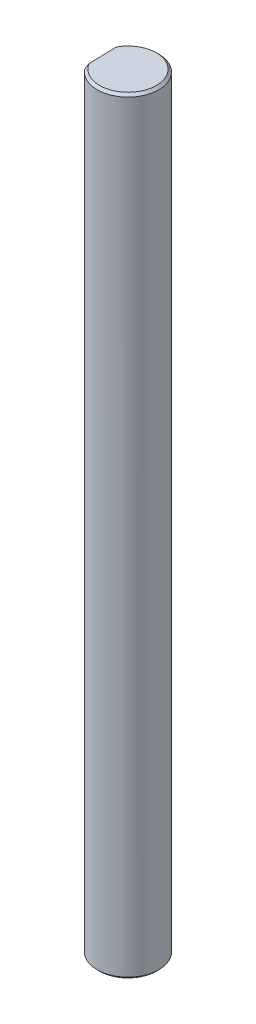
ISO-10303-21;
HEADER;
FILE_DESCRIPTION(('STEP AP214'),'2;1');
FILE_NAME('part.step','',(''),(''),'','','');
FILE_SCHEMA(('AUTOMOTIVE_DESIGN { 1 0 10303 214 1 1 1 1 }'));
ENDSEC;
DATA;
#1=APPLICATION_CONTEXT('core data for automotive mechanical design processes');
#2=APPLICATION_PROTOCOL_DEFINITION('international standard','automotive_design',2000,#1);
#3=PRODUCT_CONTEXT('',#1,'mechanical');
#4=PRODUCT('Part','Part','',(#3));
#5=PRODUCT_RELATED_PRODUCT_CATEGORY('part','',(#4));
#6=PRODUCT_DEFINITION_FORMATION('','',#4);
#7=PRODUCT_DEFINITION_CONTEXT('part definition',#1,'design');
#8=PRODUCT_DEFINITION('design','',#6,#7);
#9=PRODUCT_DEFINITION_SHAPE('','',#8);
#10=(LENGTH_UNIT() NAMED_UNIT(*) SI_UNIT(.MILLI.,.METRE.));
#11=(NAMED_UNIT(*) PLANE_ANGLE_UNIT() SI_UNIT($,.RADIAN.));
#12=(NAMED_UNIT(*) SI_UNIT($,.STERADIAN.) SOLID_ANGLE_UNIT());
#13=UNCERTAINTY_MEASURE_WITH_UNIT(LENGTH_MEASURE(1.E-05),#10,'distance_accuracy_value','');
#14=(GEOMETRIC_REPRESENTATION_CONTEXT(3) GLOBAL_UNCERTAINTY_ASSIGNED_CONTEXT((#13)) GLOBAL_UNIT_ASSIGNED_CONTEXT((#10,
#11,#12)) REPRESENTATION_CONTEXT('',''));
#15=CARTESIAN_POINT('',(0.,0.,0.));
#16=DIRECTION('',(0.,0.,1.));
#17=DIRECTION('',(1.,0.,0.));
#18=AXIS2_PLACEMENT_3D('',#15,#16,#17);
#19=CARTESIAN_POINT('',(0.,62.2,0.));
#20=DIRECTION('',(0.,-1.,0.));
#21=DIRECTION('',(0.,0.,-1.));
#22=AXIS2_PLACEMENT_3D('',#19,#20,#21);
#23=CYLINDRICAL_SURFACE('',#22,2.5);
#24=CARTESIAN_POINT('',(0.,0.200000000000027,0.));
#25=DIRECTION('',(0.,1.,0.));
#26=DIRECTION('',(0.,0.,1.));
#27=AXIS2_PLACEMENT_3D('',#24,#25,#26);
#28=CIRCLE('',#27,2.5);
#29=CARTESIAN_POINT('',(0.,0.200000000000027,2.5));
#30=VERTEX_POINT('',#29);
#31=EDGE_CURVE('E58',#30,#30,#28,.T.);
#32=ORIENTED_EDGE('',*,*,#31,.T.);
#33=EDGE_LOOP('',(#32));
#34=FACE_BOUND('',#33,.T.);
#35=DIRECTION('',(0.,1.,0.));
#36=VECTOR('',#35,1.);
#37=CARTESIAN_POINT('',(-2.03929167423056,42.2,-1.44612913234397));
#38=LINE('',#37,#36);
#39=CARTESIAN_POINT('',(-2.03929167423056,42.2,-1.44612913234397));
#40=VERTEX_POINT('',#39);
#41=CARTESIAN_POINT('',(-2.03929167423056,62.,-1.44612913234397));
#42=VERTEX_POINT('',#41);
#43=EDGE_CURVE('E95',#40,#42,#38,.T.);
#44=ORIENTED_EDGE('',*,*,#43,.T.);
#45=CARTESIAN_POINT('',(0.,62.,0.));
#46=DIRECTION('',(0.,1.,0.));
#47=DIRECTION('',(0.,0.,1.));
#48=AXIS2_PLACEMENT_3D('',#45,#46,#47);
#49=CIRCLE('',#48,2.5);
#50=CARTESIAN_POINT('',(-1.95928563583477,62.,1.55280385020502));
#51=VERTEX_POINT('',#50);
#52=EDGE_CURVE('E65',#42,#51,#49,.F.);
#53=ORIENTED_EDGE('',*,*,#52,.T.);
#54=DIRECTION('',(0.,1.,0.));
#55=VECTOR('',#54,1.);
#56=CARTESIAN_POINT('',(-1.95928563583477,42.2,1.55280385020502));
#57=LINE('',#56,#55);
#58=CARTESIAN_POINT('',(-1.95928563583477,42.2,1.55280385020502));
#59=VERTEX_POINT('',#58);
#60=EDGE_CURVE('E93',#59,#51,#57,.T.);
#61=ORIENTED_EDGE('',*,*,#60,.F.);
#62=CARTESIAN_POINT('',(0.,42.2,0.));
#63=DIRECTION('',(0.,1.,0.));
#64=DIRECTION('',(0.,0.,1.));
#65=AXIS2_PLACEMENT_3D('',#62,#63,#64);
#66=CIRCLE('',#65,2.5);
#67=EDGE_CURVE('E86',#40,#59,#66,.T.);
#68=ORIENTED_EDGE('',*,*,#67,.F.);
#69=EDGE_LOOP('',(#44,#53,#61,#68));
#70=FACE_BOUND('',#69,.T.);
#71=ADVANCED_FACE('F48',(#34,#70),#23,.T.);
#72=CARTESIAN_POINT('',(0.,62.2,0.));
#73=DIRECTION('',(0.,1.,0.));
#74=DIRECTION('',(0.,0.,1.));
#75=AXIS2_PLACEMENT_3D('',#72,#73,#74);
#76=PLANE('',#75);
#77=DIRECTION('',(-0.026668679465262,0.,-0.999644327516332));
#78=VECTOR('',#77,1.);
#79=CARTESIAN_POINT('',(-2.03929167423056,62.2,-1.44612913234397));
#80=LINE('',#79,#78);
#81=CARTESIAN_POINT('',(-1.96899885775531,62.2,1.18871506180346));
#82=VERTEX_POINT('',#81);
#83=CARTESIAN_POINT('',(-2.02957845231002,62.2,-1.08204034394241));
#84=VERTEX_POINT('',#83);
#85=EDGE_CURVE('E101',#82,#84,#80,.T.);
#86=ORIENTED_EDGE('',*,*,#85,.F.);
#87=CARTESIAN_POINT('',(0.,62.2,0.));
#88=DIRECTION('',(0.,1.,0.));
#89=DIRECTION('',(0.,0.,1.));
#90=AXIS2_PLACEMENT_3D('',#87,#88,#89);
#91=CIRCLE('',#90,2.30000000000003);
#92=EDGE_CURVE('E106',#82,#84,#91,.T.);
#93=ORIENTED_EDGE('',*,*,#92,.T.);
#94=EDGE_LOOP('',(#86,#93));
#95=FACE_BOUND('',#94,.T.);
#96=ADVANCED_FACE('F132',(#95),#76,.T.);
#97=CARTESIAN_POINT('',(0.,0.,0.));
#98=DIRECTION('',(0.,1.,0.));
#99=DIRECTION('',(0.,0.,1.));
#100=AXIS2_PLACEMENT_3D('',#97,#98,#99);
#101=PLANE('',#100);
#102=CARTESIAN_POINT('',(0.,0.,0.));
#103=DIRECTION('',(0.,1.,0.));
#104=DIRECTION('',(0.,0.,1.));
#105=AXIS2_PLACEMENT_3D('',#102,#103,#104);
#106=CIRCLE('',#105,2.29999999999998);
#107=CARTESIAN_POINT('',(0.,0.,2.29999999999998));
#108=VERTEX_POINT('',#107);
#109=EDGE_CURVE('E11',#108,#108,#106,.F.);
#110=ORIENTED_EDGE('',*,*,#109,.T.);
#111=EDGE_LOOP('',(#110));
#112=FACE_BOUND('',#111,.T.);
#113=ADVANCED_FACE('F131',(#112),#101,.F.);
#114=CARTESIAN_POINT('',(-2.03929167423056,42.2,-1.44612913234397));
#115=DIRECTION('',(0.999644327516332,0.,-0.026668679465262));
#116=DIRECTION('',(-0.026668679465262,0.,-0.999644327516332));
#117=AXIS2_PLACEMENT_3D('',#114,#115,#116);
#118=PLANE('',#117);
#119=ORIENTED_EDGE('',*,*,#85,.T.);
#120=CARTESIAN_POINT('',(-2.02957845231002,62.2,-1.08204034394241));
#121=CARTESIAN_POINT('',(-2.03040687863031,62.1846588897814,-1.11309293778839));
#122=CARTESIAN_POINT('',(-2.03123025191123,62.1689381376528,-1.14395612435072));
#123=CARTESIAN_POINT('',(-2.03286707796802,62.1368162971825,-1.20531063892007));
#124=CARTESIAN_POINT('',(-2.03368053472172,62.120415494086,-1.23580211603201));
#125=CARTESIAN_POINT('',(-2.03529835636134,62.0870005487157,-1.2964442722017));
#126=CARTESIAN_POINT('',(-2.03610272174081,62.0699864399503,-1.32659496976029));
#127=CARTESIAN_POINT('',(-2.03770328003974,62.0353973160197,-1.38659002975073));
#128=CARTESIAN_POINT('',(-2.03849946942627,62.0178220708339,-1.41643425975495));
#129=CARTESIAN_POINT('',(-2.03929167423056,62.,-1.44612913234397));
#130=B_SPLINE_CURVE_WITH_KNOTS('',3,(#120,#121,#122,#123,#124,#125,#126,#127,#128,#129),
.UNSPECIFIED.,.F.,.F.,(4,2,2,2,4),(0.,0.103930863284089,0.207818565532273,0.311700600383596,
0.415625779466335),.UNSPECIFIED.);
#131=EDGE_CURVE('E73',#84,#42,#130,.T.);
#132=ORIENTED_EDGE('',*,*,#131,.T.);
#133=ORIENTED_EDGE('',*,*,#43,.F.);
#134=DIRECTION('',(-0.026668679465262,0.,-0.999644327516332));
#135=VECTOR('',#134,1.);
#136=CARTESIAN_POINT('',(-2.03929167423056,42.2,-1.44612913234397));
#137=LINE('',#136,#135);
#138=EDGE_CURVE('E89',#59,#40,#137,.T.);
#139=ORIENTED_EDGE('',*,*,#138,.F.);
#140=ORIENTED_EDGE('',*,*,#60,.T.);
#141=CARTESIAN_POINT('',(-1.95928563583477,62.,1.55280385020502));
#142=CARTESIAN_POINT('',(-1.96007784063906,62.0178220708339,1.523108977616));
#143=CARTESIAN_POINT('',(-1.96087403002559,62.0353973160197,1.49326474761178));
#144=CARTESIAN_POINT('',(-1.96247458832452,62.0699864399503,1.43326968762133));
#145=CARTESIAN_POINT('',(-1.96327895370399,62.0870005487157,1.40311899006274));
#146=CARTESIAN_POINT('',(-1.96489677534361,62.120415494086,1.34247683389306));
#147=CARTESIAN_POINT('',(-1.96571023209731,62.1368162971825,1.31198535678112));
#148=CARTESIAN_POINT('',(-1.9673470581541,62.1689381376528,1.25063084221177));
#149=CARTESIAN_POINT('',(-1.96817043143502,62.1846588897814,1.21976765564944));
#150=CARTESIAN_POINT('',(-1.96899885775531,62.2,1.18871506180346));
#151=B_SPLINE_CURVE_WITH_KNOTS('',3,(#141,#142,#143,#144,#145,#146,#147,#148,#149,#150),
.UNSPECIFIED.,.F.,.F.,(4,2,2,2,4),(0.,0.103925179082747,0.207807213934062,0.311694916182246,
0.415625779466336),.UNSPECIFIED.);
#152=EDGE_CURVE('E110',#51,#82,#151,.T.);
#153=ORIENTED_EDGE('',*,*,#152,.T.);
#154=EDGE_LOOP('',(#119,#132,#133,#139,#140,#153));
#155=FACE_BOUND('',#154,.T.);
#156=ADVANCED_FACE('F92',(#155),#118,.F.);
#157=CARTESIAN_POINT('',(0.,42.2,0.));
#158=DIRECTION('',(0.,1.,0.));
#159=DIRECTION('',(0.,0.,1.));
#160=AXIS2_PLACEMENT_3D('',#157,#158,#159);
#161=PLANE('',#160);
#162=ORIENTED_EDGE('',*,*,#67,.T.);
#163=ORIENTED_EDGE('',*,*,#138,.T.);
#164=EDGE_LOOP('',(#162,#163));
#165=FACE_BOUND('',#164,.T.);
#166=ADVANCED_FACE('F88',(#165),#161,.T.);
#167=CARTESIAN_POINT('',(0.,62.2,0.));
#168=DIRECTION('',(0.,-1.,0.));
#169=DIRECTION('',(0.,0.,-1.));
#170=AXIS2_PLACEMENT_3D('',#167,#168,#169);
#171=CONICAL_SURFACE('',#170,2.30000000000003,0.785398163397445);
#172=ORIENTED_EDGE('',*,*,#152,.F.);
#173=ORIENTED_EDGE('',*,*,#52,.F.);
#174=ORIENTED_EDGE('',*,*,#131,.F.);
#175=ORIENTED_EDGE('',*,*,#92,.F.);
#176=EDGE_LOOP('',(#172,#173,#174,#175));
#177=FACE_BOUND('',#176,.T.);
#178=ADVANCED_FACE('F124',(#177),#171,.T.);
#179=CARTESIAN_POINT('',(0.,0.200000000000027,0.));
#180=DIRECTION('',(0.,1.,0.));
#181=DIRECTION('',(0.,0.,1.));
#182=AXIS2_PLACEMENT_3D('',#179,#180,#181);
#183=CONICAL_SURFACE('',#182,2.5,0.785398163397441);
#184=CARTESIAN_POINT('',(0.,0.,2.29999999999998));
#185=CARTESIAN_POINT('',(0.,0.00208333333333354,2.30208333333331));
#186=CARTESIAN_POINT('',(0.,0.00416666666666717,2.30416666666664));
#187=CARTESIAN_POINT('',(0.,0.00833333333333443,2.30833333333331));
#188=CARTESIAN_POINT('',(0.,0.0104166666666681,2.31041666666664));
#189=CARTESIAN_POINT('',(0.,0.0145833333333353,2.31458333333331));
#190=CARTESIAN_POINT('',(0.,0.0166666666666688,2.31666666666664));
#191=CARTESIAN_POINT('',(0.,0.020833333333336,2.32083333333331));
#192=CARTESIAN_POINT('',(0.,0.0229166666666697,2.32291666666664));
#193=CARTESIAN_POINT('',(0.,0.0270833333333369,2.32708333333331));
#194=CARTESIAN_POINT('',(0.,0.0291666666666706,2.32916666666665));
#195=CARTESIAN_POINT('',(0.,0.0333333333333378,2.33333333333331));
#196=CARTESIAN_POINT('',(0.,0.0354166666666713,2.33541666666665));
#197=CARTESIAN_POINT('',(0.,0.0395833333333385,2.33958333333331));
#198=CARTESIAN_POINT('',(0.,0.0416666666666722,2.34166666666665));
#199=CARTESIAN_POINT('',(0.,0.0458333333333394,2.34583333333331));
#200=CARTESIAN_POINT('',(0.,0.047916666666673,2.34791666666665));
#201=CARTESIAN_POINT('',(0.,0.0520833333333402,2.35208333333331));
#202=CARTESIAN_POINT('',(0.,0.0541666666666739,2.35416666666665));
#203=CARTESIAN_POINT('',(0.,0.0583333333333411,2.35833333333332));
#204=CARTESIAN_POINT('',(0.,0.0604166666666746,2.36041666666665));
#205=CARTESIAN_POINT('',(0.,0.0645833333333418,2.36458333333332));
#206=CARTESIAN_POINT('',(0.,0.0666666666666755,2.36666666666665));
#207=CARTESIAN_POINT('',(0.,0.0708333333333427,2.37083333333332));
#208=CARTESIAN_POINT('',(0.,0.0729166666666764,2.37291666666665));
#209=CARTESIAN_POINT('',(0.,0.0770833333333436,2.37708333333332));
#210=CARTESIAN_POINT('',(0.,0.0791666666666771,2.37916666666665));
#211=CARTESIAN_POINT('',(0.,0.0833333333333443,2.38333333333332));
#212=CARTESIAN_POINT('',(0.,0.085416666666678,2.38541666666665));
#213=CARTESIAN_POINT('',(0.,0.0895833333333452,2.38958333333332));
#214=CARTESIAN_POINT('',(0.,0.0916666666666788,2.39166666666665));
#215=CARTESIAN_POINT('',(0.,0.095833333333346,2.39583333333332));
#216=CARTESIAN_POINT('',(0.,0.0979166666666797,2.39791666666665));
#217=CARTESIAN_POINT('',(0.,0.102083333333347,2.40208333333332));
#218=CARTESIAN_POINT('',(0.,0.10416666666668,2.40416666666665));
#219=CARTESIAN_POINT('',(0.,0.108333333333348,2.40833333333332));
#220=CARTESIAN_POINT('',(0.,0.110416666666681,2.41041666666665));
#221=CARTESIAN_POINT('',(0.,0.114583333333349,2.41458333333332));
#222=CARTESIAN_POINT('',(0.,0.116666666666682,2.41666666666666));
#223=CARTESIAN_POINT('',(0.,0.120833333333349,2.42083333333332));
#224=CARTESIAN_POINT('',(0.,0.122916666666683,2.42291666666666));
#225=CARTESIAN_POINT('',(0.,0.12708333333335,2.42708333333332));
#226=CARTESIAN_POINT('',(0.,0.129166666666684,2.42916666666666));
#227=CARTESIAN_POINT('',(0.,0.133333333333351,2.43333333333332));
#228=CARTESIAN_POINT('',(0.,0.135416666666685,2.43541666666666));
#229=CARTESIAN_POINT('',(0.,0.139583333333352,2.43958333333332));
#230=CARTESIAN_POINT('',(0.,0.141666666666685,2.44166666666666));
#231=CARTESIAN_POINT('',(0.,0.145833333333353,2.44583333333333));
#232=CARTESIAN_POINT('',(0.,0.147916666666686,2.44791666666666));
#233=CARTESIAN_POINT('',(0.,0.152083333333353,2.45208333333333));
#234=CARTESIAN_POINT('',(0.,0.154166666666687,2.45416666666666));
#235=CARTESIAN_POINT('',(0.,0.158333333333354,2.45833333333333));
#236=CARTESIAN_POINT('',(0.,0.160416666666688,2.46041666666666));
#237=CARTESIAN_POINT('',(0.,0.164583333333355,2.46458333333333));
#238=CARTESIAN_POINT('',(0.,0.166666666666689,2.46666666666666));
#239=CARTESIAN_POINT('',(0.,0.170833333333356,2.47083333333333));
#240=CARTESIAN_POINT('',(0.,0.17291666666669,2.47291666666666));
#241=CARTESIAN_POINT('',(0.,0.177083333333357,2.47708333333333));
#242=CARTESIAN_POINT('',(0.,0.17916666666669,2.47916666666666));
#243=CARTESIAN_POINT('',(0.,0.183333333333358,2.48333333333333));
#244=CARTESIAN_POINT('',(0.,0.185416666666691,2.48541666666666));
#245=CARTESIAN_POINT('',(0.,0.189583333333359,2.48958333333333));
#246=CARTESIAN_POINT('',(0.,0.191666666666692,2.49166666666666));
#247=CARTESIAN_POINT('',(0.,0.195833333333359,2.49583333333333));
#248=CARTESIAN_POINT('',(0.,0.197916666666693,2.49791666666667));
#249=CARTESIAN_POINT('',(0.,0.200000000000027,2.5));
#250=B_SPLINE_CURVE_WITH_KNOTS('',3,(#184,#185,#186,#187,#188,#189,#190,#191,#192,#193,#194,
#195,#196,#197,#198,#199,#200,#201,#202,#203,#204,#205,#206,#207,#208,#209,#210,#211,#212,#213,
#214,#215,#216,#217,#218,#219,#220,#221,#222,#223,#224,#225,#226,#227,#228,#229,#230,#231,#232,
#233,#234,#235,#236,#237,#238,#239,#240,#241,#242,#243,#244,#245,#246,#247,#248,#249),
.UNSPECIFIED.,.F.,.F.,(4,2,2,2,2,2,2,2,2,2,2,2,2,2,2,2,2,2,2,2,2,2,2,2,2,2,2,2,2,2,2,2,4),(0.,
0.00883883476483286,0.0176776695296657,0.0265165042944989,0.0353553390593318,0.0441941738241646,
0.0530330085889978,0.0618718433538307,0.0707106781186635,0.0795495128834964,0.0883883476483295,
0.0972271824131624,0.106066017177995,0.114904851942828,0.123743686707661,0.132582521472494,
0.141421356237327,0.15026019100216,0.159099025766993,0.167937860531826,0.176776695296659,
0.185615530061492,0.194454364826325,0.203293199591158,0.212132034355991,0.220970869120824,
0.229809703885657,0.23864853865049,0.247487373415323,0.256326208180156,0.265165042944988,
0.274003877709822,0.282842712474654),.UNSPECIFIED.);
#251=EDGE_CURVE('BSEAM51',#108,#30,#250,.T.);
#252=ORIENTED_EDGE('',*,*,#109,.F.);
#253=ORIENTED_EDGE('',*,*,#31,.F.);
#254=ORIENTED_EDGE('',*,*,#251,.T.);
#255=ORIENTED_EDGE('',*,*,#251,.F.);
#256=EDGE_LOOP('',(#252,#254,#253,#255));
#257=FACE_BOUND('',#256,.T.);
#258=ADVANCED_FACE('F51',(#257),#183,.T.);
#259=CLOSED_SHELL('',(#71,#96,#113,#156,#166,#178,#258));
#260=MANIFOLD_SOLID_BREP('B2',#259);
#261=ADVANCED_BREP_SHAPE_REPRESENTATION('',(#18,#260),#14);
#262=SHAPE_DEFINITION_REPRESENTATION(#9,#261);
ENDSEC;
END-ISO-10303-21;
